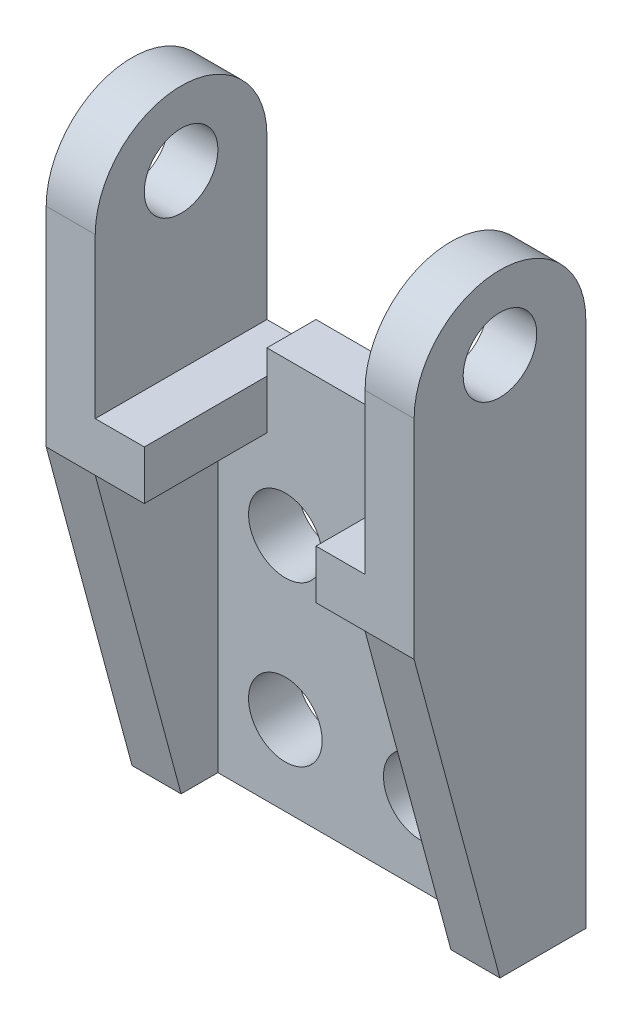
ISO-10303-21;
HEADER;
FILE_DESCRIPTION(('STEP AP214'),'2;1');
FILE_NAME('part.step','',(''),(''),'','','');
FILE_SCHEMA(('AUTOMOTIVE_DESIGN { 1 0 10303 214 1 1 1 1 }'));
ENDSEC;
DATA;
#1=APPLICATION_CONTEXT('core data for automotive mechanical design processes');
#2=APPLICATION_PROTOCOL_DEFINITION('international standard','automotive_design',2000,#1);
#3=PRODUCT_CONTEXT('',#1,'mechanical');
#4=PRODUCT('Part','Part','',(#3));
#5=PRODUCT_RELATED_PRODUCT_CATEGORY('part','',(#4));
#6=PRODUCT_DEFINITION_FORMATION('','',#4);
#7=PRODUCT_DEFINITION_CONTEXT('part definition',#1,'design');
#8=PRODUCT_DEFINITION('design','',#6,#7);
#9=PRODUCT_DEFINITION_SHAPE('','',#8);
#10=(LENGTH_UNIT() NAMED_UNIT(*) SI_UNIT(.MILLI.,.METRE.));
#11=(NAMED_UNIT(*) PLANE_ANGLE_UNIT() SI_UNIT($,.RADIAN.));
#12=(NAMED_UNIT(*) SI_UNIT($,.STERADIAN.) SOLID_ANGLE_UNIT());
#13=UNCERTAINTY_MEASURE_WITH_UNIT(LENGTH_MEASURE(1.E-05),#10,'distance_accuracy_value','');
#14=(GEOMETRIC_REPRESENTATION_CONTEXT(3) GLOBAL_UNCERTAINTY_ASSIGNED_CONTEXT((#13)) GLOBAL_UNIT_ASSIGNED_CONTEXT((#10,
#11,#12)) REPRESENTATION_CONTEXT('',''));
#15=CARTESIAN_POINT('',(0.,0.,0.));
#16=DIRECTION('',(0.,0.,1.));
#17=DIRECTION('',(1.,0.,0.));
#18=AXIS2_PLACEMENT_3D('',#15,#16,#17);
#19=CARTESIAN_POINT('',(7.5,9.,3.5));
#20=DIRECTION('',(-1.,0.,0.));
#21=DIRECTION('',(0.,0.,1.));
#22=AXIS2_PLACEMENT_3D('',#19,#20,#21);
#23=CYLINDRICAL_SURFACE('',#22,3.5);
#24=DIRECTION('',(1.,0.,0.));
#25=VECTOR('',#24,1.);
#26=CARTESIAN_POINT('',(7.5,9.,7.));
#27=LINE('',#26,#25);
#28=CARTESIAN_POINT('',(7.5,9.,7.));
#29=VERTEX_POINT('',#28);
#30=CARTESIAN_POINT('',(5.5,9.,7.));
#31=VERTEX_POINT('',#30);
#32=EDGE_CURVE('E360',#29,#31,#27,.F.);
#33=ORIENTED_EDGE('',*,*,#32,.F.);
#34=CARTESIAN_POINT('',(7.5,9.,3.5));
#35=DIRECTION('',(-1.,0.,0.));
#36=DIRECTION('',(0.,-1.,0.));
#37=AXIS2_PLACEMENT_3D('',#34,#35,#36);
#38=CIRCLE('',#37,3.5);
#39=CARTESIAN_POINT('',(7.5,9.,0.));
#40=VERTEX_POINT('',#39);
#41=EDGE_CURVE('E45',#40,#29,#38,.F.);
#42=ORIENTED_EDGE('',*,*,#41,.F.);
#43=DIRECTION('',(-1.,0.,0.));
#44=VECTOR('',#43,1.);
#45=CARTESIAN_POINT('',(0.,9.,0.));
#46=LINE('',#45,#44);
#47=CARTESIAN_POINT('',(5.5,9.,0.));
#48=VERTEX_POINT('',#47);
#49=EDGE_CURVE('E363',#48,#40,#46,.F.);
#50=ORIENTED_EDGE('',*,*,#49,.F.);
#51=CARTESIAN_POINT('',(5.5,9.,3.5));
#52=DIRECTION('',(1.,0.,0.));
#53=DIRECTION('',(0.,0.,-1.));
#54=AXIS2_PLACEMENT_3D('',#51,#52,#53);
#55=CIRCLE('',#54,3.5);
#56=EDGE_CURVE('E11',#31,#48,#55,.F.);
#57=ORIENTED_EDGE('',*,*,#56,.F.);
#58=EDGE_LOOP('',(#33,#42,#50,#57));
#59=FACE_BOUND('',#58,.T.);
#60=ADVANCED_FACE('F37',(#59),#23,.T.);
#61=CARTESIAN_POINT('',(-5.50000000000001,9.,3.5));
#62=DIRECTION('',(-1.,0.,0.));
#63=DIRECTION('',(0.,0.,1.));
#64=AXIS2_PLACEMENT_3D('',#61,#62,#63);
#65=CYLINDRICAL_SURFACE('',#64,3.5);
#66=DIRECTION('',(1.,0.,0.));
#67=VECTOR('',#66,1.);
#68=CARTESIAN_POINT('',(-5.50000000000001,9.,7.));
#69=LINE('',#68,#67);
#70=CARTESIAN_POINT('',(-5.50000000000001,9.,7.));
#71=VERTEX_POINT('',#70);
#72=CARTESIAN_POINT('',(-7.5,9.,7.));
#73=VERTEX_POINT('',#72);
#74=EDGE_CURVE('E347',#71,#73,#69,.F.);
#75=ORIENTED_EDGE('',*,*,#74,.F.);
#76=CARTESIAN_POINT('',(-5.50000000000001,9.,3.5));
#77=DIRECTION('',(1.,0.,0.));
#78=DIRECTION('',(0.,1.,0.));
#79=AXIS2_PLACEMENT_3D('',#76,#77,#78);
#80=CIRCLE('',#79,3.5);
#81=CARTESIAN_POINT('',(-5.50000000000001,9.,0.));
#82=VERTEX_POINT('',#81);
#83=EDGE_CURVE('E356',#82,#71,#80,.T.);
#84=ORIENTED_EDGE('',*,*,#83,.F.);
#85=DIRECTION('',(-1.,0.,0.));
#86=VECTOR('',#85,1.);
#87=CARTESIAN_POINT('',(0.,9.,0.));
#88=LINE('',#87,#86);
#89=CARTESIAN_POINT('',(-7.5,9.,0.));
#90=VERTEX_POINT('',#89);
#91=EDGE_CURVE('E354',#90,#82,#88,.F.);
#92=ORIENTED_EDGE('',*,*,#91,.F.);
#93=CARTESIAN_POINT('',(-7.5,9.,3.5));
#94=DIRECTION('',(1.,0.,0.));
#95=DIRECTION('',(0.,1.,0.));
#96=AXIS2_PLACEMENT_3D('',#93,#94,#95);
#97=CIRCLE('',#96,3.5);
#98=EDGE_CURVE('E358',#73,#90,#97,.F.);
#99=ORIENTED_EDGE('',*,*,#98,.F.);
#100=EDGE_LOOP('',(#75,#84,#92,#99));
#101=FACE_BOUND('',#100,.T.);
#102=ADVANCED_FACE('F423',(#101),#65,.T.);
#103=CARTESIAN_POINT('',(0.,0.,0.));
#104=DIRECTION('',(0.,0.,1.));
#105=DIRECTION('',(1.,0.,0.));
#106=AXIS2_PLACEMENT_3D('',#103,#104,#105);
#107=PLANE('',#106);
#108=CARTESIAN_POINT('',(-2.75,-2.75,0.));
#109=DIRECTION('',(0.,0.,1.));
#110=DIRECTION('',(1.,0.,0.));
#111=AXIS2_PLACEMENT_3D('',#108,#109,#110);
#112=CIRCLE('',#111,1.5);
#113=CARTESIAN_POINT('',(-1.25,-2.75,0.));
#114=VERTEX_POINT('',#113);
#115=EDGE_CURVE('E252',#114,#114,#112,.T.);
#116=ORIENTED_EDGE('',*,*,#115,.T.);
#117=EDGE_LOOP('',(#116));
#118=FACE_BOUND('',#117,.T.);
#119=CARTESIAN_POINT('',(2.75,-2.75,0.));
#120=DIRECTION('',(0.,0.,1.));
#121=DIRECTION('',(1.,0.,0.));
#122=AXIS2_PLACEMENT_3D('',#119,#120,#121);
#123=CIRCLE('',#122,1.5);
#124=CARTESIAN_POINT('',(4.25,-2.75,0.));
#125=VERTEX_POINT('',#124);
#126=EDGE_CURVE('E246',#125,#125,#123,.T.);
#127=ORIENTED_EDGE('',*,*,#126,.T.);
#128=EDGE_LOOP('',(#127));
#129=FACE_BOUND('',#128,.T.);
#130=CARTESIAN_POINT('',(-2.75,-9.25000000000001,0.));
#131=DIRECTION('',(0.,0.,1.));
#132=DIRECTION('',(1.,0.,0.));
#133=AXIS2_PLACEMENT_3D('',#130,#131,#132);
#134=CIRCLE('',#133,1.5);
#135=CARTESIAN_POINT('',(-1.25,-9.25000000000001,0.));
#136=VERTEX_POINT('',#135);
#137=EDGE_CURVE('E240',#136,#136,#134,.T.);
#138=ORIENTED_EDGE('',*,*,#137,.T.);
#139=EDGE_LOOP('',(#138));
#140=FACE_BOUND('',#139,.T.);
#141=CARTESIAN_POINT('',(2.75,-9.25,0.));
#142=DIRECTION('',(0.,0.,1.));
#143=DIRECTION('',(1.,0.,0.));
#144=AXIS2_PLACEMENT_3D('',#141,#142,#143);
#145=CIRCLE('',#144,1.5);
#146=CARTESIAN_POINT('',(4.25,-9.25,0.));
#147=VERTEX_POINT('',#146);
#148=EDGE_CURVE('E234',#147,#147,#145,.T.);
#149=ORIENTED_EDGE('',*,*,#148,.T.);
#150=EDGE_LOOP('',(#149));
#151=FACE_BOUND('',#150,.T.);
#152=DIRECTION('',(0.,1.,0.));
#153=VECTOR('',#152,1.);
#154=CARTESIAN_POINT('',(5.5,0.,0.));
#155=LINE('',#154,#153);
#156=CARTESIAN_POINT('',(5.5,2.5,0.));
#157=VERTEX_POINT('',#156);
#158=EDGE_CURVE('E218',#157,#48,#155,.T.);
#159=ORIENTED_EDGE('',*,*,#158,.T.);
#160=ORIENTED_EDGE('',*,*,#49,.T.);
#161=DIRECTION('',(0.,1.,0.));
#162=VECTOR('',#161,1.);
#163=CARTESIAN_POINT('',(7.5,12.5,0.));
#164=LINE('',#163,#162);
#165=CARTESIAN_POINT('',(7.5,-12.5,0.));
#166=VERTEX_POINT('',#165);
#167=EDGE_CURVE('E316',#166,#40,#164,.T.);
#168=ORIENTED_EDGE('',*,*,#167,.F.);
#169=DIRECTION('',(1.,0.,0.));
#170=VECTOR('',#169,1.);
#171=CARTESIAN_POINT('',(-7.5,-12.5,0.));
#172=LINE('',#171,#170);
#173=CARTESIAN_POINT('',(-7.5,-12.5,0.));
#174=VERTEX_POINT('',#173);
#175=EDGE_CURVE('E334',#174,#166,#172,.T.);
#176=ORIENTED_EDGE('',*,*,#175,.F.);
#177=DIRECTION('',(0.,-1.,0.));
#178=VECTOR('',#177,1.);
#179=CARTESIAN_POINT('',(-7.5,12.5,0.));
#180=LINE('',#179,#178);
#181=EDGE_CURVE('E339',#90,#174,#180,.T.);
#182=ORIENTED_EDGE('',*,*,#181,.F.);
#183=ORIENTED_EDGE('',*,*,#91,.T.);
#184=DIRECTION('',(0.,1.,0.));
#185=VECTOR('',#184,1.);
#186=CARTESIAN_POINT('',(-5.49999999999999,0.,0.));
#187=LINE('',#186,#185);
#188=CARTESIAN_POINT('',(-5.5,2.49999999999999,0.));
#189=VERTEX_POINT('',#188);
#190=EDGE_CURVE('E183',#189,#82,#187,.T.);
#191=ORIENTED_EDGE('',*,*,#190,.F.);
#192=DIRECTION('',(-1.,0.,0.));
#193=VECTOR('',#192,1.);
#194=CARTESIAN_POINT('',(0.,2.5,0.));
#195=LINE('',#194,#193);
#196=CARTESIAN_POINT('',(-3.5,2.49999999999999,0.));
#197=VERTEX_POINT('',#196);
#198=EDGE_CURVE('E184',#197,#189,#195,.T.);
#199=ORIENTED_EDGE('',*,*,#198,.F.);
#200=DIRECTION('',(0.,-1.,0.));
#201=VECTOR('',#200,1.);
#202=CARTESIAN_POINT('',(-3.49999999999999,0.,0.));
#203=LINE('',#202,#201);
#204=CARTESIAN_POINT('',(-3.5,3.5,0.));
#205=VERTEX_POINT('',#204);
#206=EDGE_CURVE('E172',#205,#197,#203,.T.);
#207=ORIENTED_EDGE('',*,*,#206,.F.);
#208=DIRECTION('',(1.,0.,0.));
#209=VECTOR('',#208,1.);
#210=CARTESIAN_POINT('',(0.,3.5,0.));
#211=LINE('',#210,#209);
#212=CARTESIAN_POINT('',(3.5,3.5,0.));
#213=VERTEX_POINT('',#212);
#214=EDGE_CURVE('E280',#205,#213,#211,.T.);
#215=ORIENTED_EDGE('',*,*,#214,.T.);
#216=DIRECTION('',(0.,-1.,0.));
#217=VECTOR('',#216,1.);
#218=CARTESIAN_POINT('',(3.5,0.,0.));
#219=LINE('',#218,#217);
#220=CARTESIAN_POINT('',(3.5,2.5,0.));
#221=VERTEX_POINT('',#220);
#222=EDGE_CURVE('E221',#213,#221,#219,.T.);
#223=ORIENTED_EDGE('',*,*,#222,.T.);
#224=DIRECTION('',(1.,0.,0.));
#225=VECTOR('',#224,1.);
#226=CARTESIAN_POINT('',(0.,2.5,0.));
#227=LINE('',#226,#225);
#228=EDGE_CURVE('E215',#221,#157,#227,.T.);
#229=ORIENTED_EDGE('',*,*,#228,.T.);
#230=EDGE_LOOP('',(#159,#160,#168,#176,#182,#183,#191,#199,#207,#215,#223,#229));
#231=FACE_BOUND('',#230,.T.);
#232=ADVANCED_FACE('F196',(#118,#129,#140,#151,#231),#107,.F.);
#233=CARTESIAN_POINT('',(0.,0.,7.));
#234=DIRECTION('',(0.,0.,1.));
#235=DIRECTION('',(1.,0.,0.));
#236=AXIS2_PLACEMENT_3D('',#233,#234,#235);
#237=PLANE('',#236);
#238=DIRECTION('',(0.,1.,0.));
#239=VECTOR('',#238,1.);
#240=CARTESIAN_POINT('',(-5.49999999999999,0.,7.));
#241=LINE('',#240,#239);
#242=CARTESIAN_POINT('',(-5.5,2.49999999999999,7.));
#243=VERTEX_POINT('',#242);
#244=EDGE_CURVE('E199',#243,#71,#241,.T.);
#245=ORIENTED_EDGE('',*,*,#244,.T.);
#246=ORIENTED_EDGE('',*,*,#74,.T.);
#247=DIRECTION('',(0.,-1.,0.));
#248=VECTOR('',#247,1.);
#249=CARTESIAN_POINT('',(-7.5,12.5,7.));
#250=LINE('',#249,#248);
#251=CARTESIAN_POINT('',(-7.5,0.499999999999999,7.));
#252=VERTEX_POINT('',#251);
#253=EDGE_CURVE('E333',#73,#252,#250,.T.);
#254=ORIENTED_EDGE('',*,*,#253,.T.);
#255=DIRECTION('',(-1.,0.,0.));
#256=VECTOR('',#255,1.);
#257=CARTESIAN_POINT('',(7.5,0.5,7.));
#258=LINE('',#257,#256);
#259=CARTESIAN_POINT('',(-5.5,0.499999999999999,7.));
#260=VERTEX_POINT('',#259);
#261=EDGE_CURVE('E261',#260,#252,#258,.T.);
#262=ORIENTED_EDGE('',*,*,#261,.F.);
#263=DIRECTION('',(1.,0.,0.));
#264=VECTOR('',#263,1.);
#265=CARTESIAN_POINT('',(0.,0.499999999999999,7.));
#266=LINE('',#265,#264);
#267=CARTESIAN_POINT('',(-3.5,0.499999999999999,7.));
#268=VERTEX_POINT('',#267);
#269=EDGE_CURVE('E287',#260,#268,#266,.T.);
#270=ORIENTED_EDGE('',*,*,#269,.T.);
#271=DIRECTION('',(0.,1.,0.));
#272=VECTOR('',#271,1.);
#273=CARTESIAN_POINT('',(-3.5,0.,7.));
#274=LINE('',#273,#272);
#275=CARTESIAN_POINT('',(-3.5,2.49999999999999,7.));
#276=VERTEX_POINT('',#275);
#277=EDGE_CURVE('E308',#268,#276,#274,.T.);
#278=ORIENTED_EDGE('',*,*,#277,.T.);
#279=DIRECTION('',(-1.,0.,0.));
#280=VECTOR('',#279,1.);
#281=CARTESIAN_POINT('',(0.,2.5,7.));
#282=LINE('',#281,#280);
#283=EDGE_CURVE('E202',#276,#243,#282,.T.);
#284=ORIENTED_EDGE('',*,*,#283,.T.);
#285=EDGE_LOOP('',(#245,#246,#254,#262,#270,#278,#284));
#286=FACE_BOUND('',#285,.T.);
#287=ADVANCED_FACE('F431',(#286),#237,.T.);
#288=CARTESIAN_POINT('',(-3.5,0.,2.));
#289=DIRECTION('',(1.,0.,0.));
#290=DIRECTION('',(0.,1.,0.));
#291=AXIS2_PLACEMENT_3D('',#288,#289,#290);
#292=PLANE('',#291);
#293=DIRECTION('',(0.,1.,0.));
#294=VECTOR('',#293,1.);
#295=CARTESIAN_POINT('',(-3.5,0.,2.));
#296=LINE('',#295,#294);
#297=CARTESIAN_POINT('',(-3.5,0.499999999999999,2.));
#298=VERTEX_POINT('',#297);
#299=CARTESIAN_POINT('',(-3.5,2.49999999999999,2.));
#300=VERTEX_POINT('',#299);
#301=EDGE_CURVE('E290',#298,#300,#296,.T.);
#302=ORIENTED_EDGE('',*,*,#301,.T.);
#303=DIRECTION('',(0.,0.,1.));
#304=VECTOR('',#303,1.);
#305=CARTESIAN_POINT('',(-3.5,2.49999999999999,0.));
#306=LINE('',#305,#304);
#307=EDGE_CURVE('E191',#300,#276,#306,.T.);
#308=ORIENTED_EDGE('',*,*,#307,.T.);
#309=ORIENTED_EDGE('',*,*,#277,.F.);
#310=DIRECTION('',(0.,0.,1.));
#311=VECTOR('',#310,1.);
#312=CARTESIAN_POINT('',(-3.5,0.499999999999999,2.));
#313=LINE('',#312,#311);
#314=EDGE_CURVE('E326',#298,#268,#313,.T.);
#315=ORIENTED_EDGE('',*,*,#314,.F.);
#316=EDGE_LOOP('',(#302,#308,#309,#315));
#317=FACE_BOUND('',#316,.T.);
#318=ADVANCED_FACE('F460',(#317),#292,.T.);
#319=CARTESIAN_POINT('',(0.,0.,2.));
#320=DIRECTION('',(0.,0.,1.));
#321=DIRECTION('',(1.,0.,0.));
#322=AXIS2_PLACEMENT_3D('',#319,#320,#321);
#323=PLANE('',#322);
#324=CARTESIAN_POINT('',(2.75,-9.25,2.));
#325=DIRECTION('',(0.,0.,1.));
#326=DIRECTION('',(1.,0.,0.));
#327=AXIS2_PLACEMENT_3D('',#324,#325,#326);
#328=CIRCLE('',#327,1.5);
#329=CARTESIAN_POINT('',(4.25,-9.25,2.));
#330=VERTEX_POINT('',#329);
#331=EDGE_CURVE('E231',#330,#330,#328,.T.);
#332=ORIENTED_EDGE('',*,*,#331,.F.);
#333=EDGE_LOOP('',(#332));
#334=FACE_BOUND('',#333,.T.);
#335=CARTESIAN_POINT('',(-2.75,-9.25000000000001,2.));
#336=DIRECTION('',(0.,0.,1.));
#337=DIRECTION('',(1.,0.,0.));
#338=AXIS2_PLACEMENT_3D('',#335,#336,#337);
#339=CIRCLE('',#338,1.5);
#340=CARTESIAN_POINT('',(-1.25,-9.25000000000001,2.));
#341=VERTEX_POINT('',#340);
#342=EDGE_CURVE('E237',#341,#341,#339,.T.);
#343=ORIENTED_EDGE('',*,*,#342,.F.);
#344=EDGE_LOOP('',(#343));
#345=FACE_BOUND('',#344,.T.);
#346=CARTESIAN_POINT('',(2.75,-2.75,2.));
#347=DIRECTION('',(0.,0.,1.));
#348=DIRECTION('',(1.,0.,0.));
#349=AXIS2_PLACEMENT_3D('',#346,#347,#348);
#350=CIRCLE('',#349,1.5);
#351=CARTESIAN_POINT('',(4.25,-2.75,2.));
#352=VERTEX_POINT('',#351);
#353=EDGE_CURVE('E243',#352,#352,#350,.T.);
#354=ORIENTED_EDGE('',*,*,#353,.F.);
#355=EDGE_LOOP('',(#354));
#356=FACE_BOUND('',#355,.T.);
#357=CARTESIAN_POINT('',(-2.75,-2.75,2.));
#358=DIRECTION('',(0.,0.,1.));
#359=DIRECTION('',(1.,0.,0.));
#360=AXIS2_PLACEMENT_3D('',#357,#358,#359);
#361=CIRCLE('',#360,1.5);
#362=CARTESIAN_POINT('',(-1.25,-2.75,2.));
#363=VERTEX_POINT('',#362);
#364=EDGE_CURVE('E249',#363,#363,#361,.T.);
#365=ORIENTED_EDGE('',*,*,#364,.F.);
#366=EDGE_LOOP('',(#365));
#367=FACE_BOUND('',#366,.T.);
#368=DIRECTION('',(1.,0.,0.));
#369=VECTOR('',#368,1.);
#370=CARTESIAN_POINT('',(3.5,3.5,2.));
#371=LINE('',#370,#369);
#372=CARTESIAN_POINT('',(-3.5,3.5,2.));
#373=VERTEX_POINT('',#372);
#374=CARTESIAN_POINT('',(3.5,3.5,2.));
#375=VERTEX_POINT('',#374);
#376=EDGE_CURVE('E275',#373,#375,#371,.T.);
#377=ORIENTED_EDGE('',*,*,#376,.F.);
#378=DIRECTION('',(0.,-1.,0.));
#379=VECTOR('',#378,1.);
#380=CARTESIAN_POINT('',(-3.49999999999999,0.,2.));
#381=LINE('',#380,#379);
#382=EDGE_CURVE('E211',#373,#300,#381,.T.);
#383=ORIENTED_EDGE('',*,*,#382,.T.);
#384=ORIENTED_EDGE('',*,*,#301,.F.);
#385=DIRECTION('',(1.,0.,0.));
#386=VECTOR('',#385,1.);
#387=CARTESIAN_POINT('',(0.,0.499999999999999,2.));
#388=LINE('',#387,#386);
#389=CARTESIAN_POINT('',(-5.5,0.499999999999999,2.));
#390=VERTEX_POINT('',#389);
#391=EDGE_CURVE('E293',#390,#298,#388,.T.);
#392=ORIENTED_EDGE('',*,*,#391,.F.);
#393=DIRECTION('',(0.,-1.,0.));
#394=VECTOR('',#393,1.);
#395=CARTESIAN_POINT('',(-5.5,0.,2.));
#396=LINE('',#395,#394);
#397=CARTESIAN_POINT('',(-5.5,-12.5,2.));
#398=VERTEX_POINT('',#397);
#399=EDGE_CURVE('E295',#390,#398,#396,.T.);
#400=ORIENTED_EDGE('',*,*,#399,.T.);
#401=DIRECTION('',(1.,0.,0.));
#402=VECTOR('',#401,1.);
#403=CARTESIAN_POINT('',(0.,-12.5,2.));
#404=LINE('',#403,#402);
#405=CARTESIAN_POINT('',(5.5,-12.5,2.));
#406=VERTEX_POINT('',#405);
#407=EDGE_CURVE('E298',#398,#406,#404,.T.);
#408=ORIENTED_EDGE('',*,*,#407,.T.);
#409=DIRECTION('',(0.,1.,0.));
#410=VECTOR('',#409,1.);
#411=CARTESIAN_POINT('',(5.5,0.,2.));
#412=LINE('',#411,#410);
#413=CARTESIAN_POINT('',(5.5,0.499999999999999,2.));
#414=VERTEX_POINT('',#413);
#415=EDGE_CURVE('E300',#406,#414,#412,.T.);
#416=ORIENTED_EDGE('',*,*,#415,.T.);
#417=DIRECTION('',(1.,0.,0.));
#418=VECTOR('',#417,1.);
#419=CARTESIAN_POINT('',(0.,0.499999999999999,2.));
#420=LINE('',#419,#418);
#421=CARTESIAN_POINT('',(3.5,0.499999999999999,2.));
#422=VERTEX_POINT('',#421);
#423=EDGE_CURVE('E284',#422,#414,#420,.T.);
#424=ORIENTED_EDGE('',*,*,#423,.F.);
#425=DIRECTION('',(0.,-1.,0.));
#426=VECTOR('',#425,1.);
#427=CARTESIAN_POINT('',(3.5,0.,2.));
#428=LINE('',#427,#426);
#429=CARTESIAN_POINT('',(3.5,2.5,2.));
#430=VERTEX_POINT('',#429);
#431=EDGE_CURVE('E286',#430,#422,#428,.T.);
#432=ORIENTED_EDGE('',*,*,#431,.F.);
#433=EDGE_CURVE('E288',#375,#430,#428,.T.);
#434=ORIENTED_EDGE('',*,*,#433,.F.);
#435=EDGE_LOOP('',(#377,#383,#384,#392,#400,#408,#416,#424,#432,#434));
#436=FACE_BOUND('',#435,.T.);
#437=ADVANCED_FACE('F387',(#334,#345,#356,#367,#436),#323,.T.);
#438=CARTESIAN_POINT('',(-7.5,12.5,7.));
#439=DIRECTION('',(1.,0.,0.));
#440=DIRECTION('',(0.,1.,0.));
#441=AXIS2_PLACEMENT_3D('',#438,#439,#440);
#442=PLANE('',#441);
#443=CARTESIAN_POINT('',(-7.5,9.5,3.5));
#444=DIRECTION('',(-1.,0.,0.));
#445=DIRECTION('',(0.,-1.,0.));
#446=AXIS2_PLACEMENT_3D('',#443,#444,#445);
#447=CIRCLE('',#446,1.5);
#448=CARTESIAN_POINT('',(-7.5,8.,3.5));
#449=VERTEX_POINT('',#448);
#450=EDGE_CURVE('E541',#449,#449,#447,.T.);
#451=ORIENTED_EDGE('',*,*,#450,.F.);
#452=EDGE_LOOP('',(#451));
#453=FACE_BOUND('',#452,.T.);
#454=ORIENTED_EDGE('',*,*,#253,.F.);
#455=ORIENTED_EDGE('',*,*,#98,.T.);
#456=ORIENTED_EDGE('',*,*,#181,.T.);
#457=DIRECTION('',(0.,0.,-1.));
#458=VECTOR('',#457,1.);
#459=CARTESIAN_POINT('',(-7.5,-12.5,7.));
#460=LINE('',#459,#458);
#461=CARTESIAN_POINT('',(-7.5,-12.5,3.5));
#462=VERTEX_POINT('',#461);
#463=EDGE_CURVE('E344',#462,#174,#460,.T.);
#464=ORIENTED_EDGE('',*,*,#463,.F.);
#465=DIRECTION('',(0.,-0.965615758520669,-0.259973473447873));
#466=VECTOR('',#465,1.);
#467=CARTESIAN_POINT('',(-7.5,0.499999999999999,7.));
#468=LINE('',#467,#466);
#469=EDGE_CURVE('E255',#252,#462,#468,.T.);
#470=ORIENTED_EDGE('',*,*,#469,.F.);
#471=EDGE_LOOP('',(#454,#455,#456,#464,#470));
#472=FACE_BOUND('',#471,.T.);
#473=ADVANCED_FACE('F441',(#453,#472),#442,.F.);
#474=CARTESIAN_POINT('',(7.5,12.5,7.));
#475=DIRECTION('',(-1.,0.,0.));
#476=DIRECTION('',(0.,-1.,0.));
#477=AXIS2_PLACEMENT_3D('',#474,#475,#476);
#478=PLANE('',#477);
#479=CARTESIAN_POINT('',(7.50000000000001,9.5,3.5));
#480=DIRECTION('',(-1.,0.,0.));
#481=DIRECTION('',(0.,-1.,0.));
#482=AXIS2_PLACEMENT_3D('',#479,#480,#481);
#483=CIRCLE('',#482,1.5);
#484=CARTESIAN_POINT('',(7.50000000000001,8.,3.5));
#485=VERTEX_POINT('',#484);
#486=EDGE_CURVE('E351',#485,#485,#483,.T.);
#487=ORIENTED_EDGE('',*,*,#486,.T.);
#488=EDGE_LOOP('',(#487));
#489=FACE_BOUND('',#488,.T.);
#490=ORIENTED_EDGE('',*,*,#167,.T.);
#491=ORIENTED_EDGE('',*,*,#41,.T.);
#492=DIRECTION('',(0.,1.,0.));
#493=VECTOR('',#492,1.);
#494=CARTESIAN_POINT('',(7.5,12.5,7.));
#495=LINE('',#494,#493);
#496=CARTESIAN_POINT('',(7.5,0.5,7.));
#497=VERTEX_POINT('',#496);
#498=EDGE_CURVE('E330',#497,#29,#495,.T.);
#499=ORIENTED_EDGE('',*,*,#498,.F.);
#500=DIRECTION('',(0.,-0.965615758520669,-0.259973473447873));
#501=VECTOR('',#500,1.);
#502=CARTESIAN_POINT('',(7.5,0.5,7.));
#503=LINE('',#502,#501);
#504=CARTESIAN_POINT('',(7.5,-12.5,3.5));
#505=VERTEX_POINT('',#504);
#506=EDGE_CURVE('E258',#497,#505,#503,.T.);
#507=ORIENTED_EDGE('',*,*,#506,.T.);
#508=DIRECTION('',(0.,0.,-1.));
#509=VECTOR('',#508,1.);
#510=CARTESIAN_POINT('',(7.5,-12.5,7.));
#511=LINE('',#510,#509);
#512=EDGE_CURVE('E336',#505,#166,#511,.T.);
#513=ORIENTED_EDGE('',*,*,#512,.T.);
#514=EDGE_LOOP('',(#490,#491,#499,#507,#513));
#515=FACE_BOUND('',#514,.T.);
#516=ADVANCED_FACE('F366',(#489,#515),#478,.F.);
#517=CARTESIAN_POINT('',(-7.5,-12.5,7.));
#518=DIRECTION('',(0.,1.,0.));
#519=DIRECTION('',(0.,0.,1.));
#520=AXIS2_PLACEMENT_3D('',#517,#518,#519);
#521=PLANE('',#520);
#522=ORIENTED_EDGE('',*,*,#512,.F.);
#523=DIRECTION('',(-1.,0.,0.));
#524=VECTOR('',#523,1.);
#525=CARTESIAN_POINT('',(7.5,-12.5,3.5));
#526=LINE('',#525,#524);
#527=CARTESIAN_POINT('',(5.5,-12.5,3.5));
#528=VERTEX_POINT('',#527);
#529=EDGE_CURVE('E263',#505,#528,#526,.T.);
#530=ORIENTED_EDGE('',*,*,#529,.T.);
#531=DIRECTION('',(0.,0.,1.));
#532=VECTOR('',#531,1.);
#533=CARTESIAN_POINT('',(5.5,-12.5,2.));
#534=LINE('',#533,#532);
#535=EDGE_CURVE('E317',#406,#528,#534,.T.);
#536=ORIENTED_EDGE('',*,*,#535,.F.);
#537=ORIENTED_EDGE('',*,*,#407,.F.);
#538=DIRECTION('',(0.,0.,1.));
#539=VECTOR('',#538,1.);
#540=CARTESIAN_POINT('',(-5.5,-12.5,2.));
#541=LINE('',#540,#539);
#542=CARTESIAN_POINT('',(-5.5,-12.5,3.5));
#543=VERTEX_POINT('',#542);
#544=EDGE_CURVE('E320',#398,#543,#541,.T.);
#545=ORIENTED_EDGE('',*,*,#544,.T.);
#546=EDGE_CURVE('E267',#543,#462,#526,.T.);
#547=ORIENTED_EDGE('',*,*,#546,.T.);
#548=ORIENTED_EDGE('',*,*,#463,.T.);
#549=ORIENTED_EDGE('',*,*,#175,.T.);
#550=EDGE_LOOP('',(#522,#530,#536,#537,#545,#547,#548,#549));
#551=FACE_BOUND('',#550,.T.);
#552=ADVANCED_FACE('F392',(#551),#521,.F.);
#553=ORIENTED_EDGE('',*,*,#498,.T.);
#554=ORIENTED_EDGE('',*,*,#32,.T.);
#555=DIRECTION('',(0.,1.,0.));
#556=VECTOR('',#555,1.);
#557=CARTESIAN_POINT('',(5.5,0.,7.));
#558=LINE('',#557,#556);
#559=CARTESIAN_POINT('',(5.5,2.5,7.));
#560=VERTEX_POINT('',#559);
#561=EDGE_CURVE('E219',#560,#31,#558,.T.);
#562=ORIENTED_EDGE('',*,*,#561,.F.);
#563=DIRECTION('',(1.,0.,0.));
#564=VECTOR('',#563,1.);
#565=CARTESIAN_POINT('',(0.,2.5,7.));
#566=LINE('',#565,#564);
#567=CARTESIAN_POINT('',(3.5,2.5,7.));
#568=VERTEX_POINT('',#567);
#569=EDGE_CURVE('E214',#568,#560,#566,.T.);
#570=ORIENTED_EDGE('',*,*,#569,.F.);
#571=DIRECTION('',(0.,-1.,0.));
#572=VECTOR('',#571,1.);
#573=CARTESIAN_POINT('',(3.5,0.,7.));
#574=LINE('',#573,#572);
#575=CARTESIAN_POINT('',(3.5,0.499999999999999,7.));
#576=VERTEX_POINT('',#575);
#577=EDGE_CURVE('E306',#568,#576,#574,.T.);
#578=ORIENTED_EDGE('',*,*,#577,.T.);
#579=DIRECTION('',(1.,0.,0.));
#580=VECTOR('',#579,1.);
#581=CARTESIAN_POINT('',(0.,0.499999999999999,7.));
#582=LINE('',#581,#580);
#583=CARTESIAN_POINT('',(5.5,0.499999999999999,7.));
#584=VERTEX_POINT('',#583);
#585=EDGE_CURVE('E283',#576,#584,#582,.T.);
#586=ORIENTED_EDGE('',*,*,#585,.T.);
#587=EDGE_CURVE('E268',#497,#584,#258,.T.);
#588=ORIENTED_EDGE('',*,*,#587,.F.);
#589=EDGE_LOOP('',(#553,#554,#562,#570,#578,#586,#588));
#590=FACE_BOUND('',#589,.T.);
#591=ADVANCED_FACE('F371',(#590),#237,.T.);
#592=CARTESIAN_POINT('',(0.,0.499999999999999,2.));
#593=DIRECTION('',(0.,-1.,0.));
#594=DIRECTION('',(0.,0.,-1.));
#595=AXIS2_PLACEMENT_3D('',#592,#593,#594);
#596=PLANE('',#595);
#597=ORIENTED_EDGE('',*,*,#585,.F.);
#598=DIRECTION('',(0.,0.,1.));
#599=VECTOR('',#598,1.);
#600=CARTESIAN_POINT('',(3.5,0.499999999999999,2.));
#601=LINE('',#600,#599);
#602=EDGE_CURVE('E303',#422,#576,#601,.T.);
#603=ORIENTED_EDGE('',*,*,#602,.F.);
#604=ORIENTED_EDGE('',*,*,#423,.T.);
#605=DIRECTION('',(0.,0.,1.));
#606=VECTOR('',#605,1.);
#607=CARTESIAN_POINT('',(5.5,0.499999999999999,2.));
#608=LINE('',#607,#606);
#609=EDGE_CURVE('E313',#414,#584,#608,.T.);
#610=ORIENTED_EDGE('',*,*,#609,.T.);
#611=EDGE_LOOP('',(#597,#603,#604,#610));
#612=FACE_BOUND('',#611,.T.);
#613=ADVANCED_FACE('F381',(#612),#596,.T.);
#614=CARTESIAN_POINT('',(5.5,0.,2.));
#615=DIRECTION('',(1.,0.,0.));
#616=DIRECTION('',(0.,0.,-1.));
#617=AXIS2_PLACEMENT_3D('',#614,#615,#616);
#618=PLANE('',#617);
#619=ORIENTED_EDGE('',*,*,#535,.T.);
#620=DIRECTION('',(0.,0.96561575852067,0.259973473447873));
#621=VECTOR('',#620,1.);
#622=CARTESIAN_POINT('',(5.5,-1.22137931034483,6.53655172413793));
#623=LINE('',#622,#621);
#624=EDGE_CURVE('E272',#528,#584,#623,.T.);
#625=ORIENTED_EDGE('',*,*,#624,.T.);
#626=ORIENTED_EDGE('',*,*,#609,.F.);
#627=ORIENTED_EDGE('',*,*,#415,.F.);
#628=EDGE_LOOP('',(#619,#625,#626,#627));
#629=FACE_BOUND('',#628,.T.);
#630=ADVANCED_FACE('F377',(#629),#618,.F.);
#631=CARTESIAN_POINT('',(-5.5,0.,2.));
#632=DIRECTION('',(-1.,0.,0.));
#633=DIRECTION('',(0.,-1.,0.));
#634=AXIS2_PLACEMENT_3D('',#631,#632,#633);
#635=PLANE('',#634);
#636=DIRECTION('',(0.,0.,1.));
#637=VECTOR('',#636,1.);
#638=CARTESIAN_POINT('',(-5.5,0.499999999999999,2.));
#639=LINE('',#638,#637);
#640=EDGE_CURVE('E323',#390,#260,#639,.T.);
#641=ORIENTED_EDGE('',*,*,#640,.T.);
#642=DIRECTION('',(0.,-0.96561575852067,-0.259973473447873));
#643=VECTOR('',#642,1.);
#644=CARTESIAN_POINT('',(-5.5,-1.22137931034483,6.53655172413793));
#645=LINE('',#644,#643);
#646=EDGE_CURVE('E266',#260,#543,#645,.T.);
#647=ORIENTED_EDGE('',*,*,#646,.T.);
#648=ORIENTED_EDGE('',*,*,#544,.F.);
#649=ORIENTED_EDGE('',*,*,#399,.F.);
#650=EDGE_LOOP('',(#641,#647,#648,#649));
#651=FACE_BOUND('',#650,.T.);
#652=ADVANCED_FACE('F417',(#651),#635,.F.);
#653=CARTESIAN_POINT('',(0.,0.499999999999999,2.));
#654=DIRECTION('',(0.,-1.,0.));
#655=DIRECTION('',(0.,0.,-1.));
#656=AXIS2_PLACEMENT_3D('',#653,#654,#655);
#657=PLANE('',#656);
#658=ORIENTED_EDGE('',*,*,#269,.F.);
#659=ORIENTED_EDGE('',*,*,#640,.F.);
#660=ORIENTED_EDGE('',*,*,#391,.T.);
#661=ORIENTED_EDGE('',*,*,#314,.T.);
#662=EDGE_LOOP('',(#658,#659,#660,#661));
#663=FACE_BOUND('',#662,.T.);
#664=ADVANCED_FACE('F408',(#663),#657,.T.);
#665=CARTESIAN_POINT('',(3.5,0.,2.));
#666=DIRECTION('',(-1.,0.,0.));
#667=DIRECTION('',(0.,-1.,0.));
#668=AXIS2_PLACEMENT_3D('',#665,#666,#667);
#669=PLANE('',#668);
#670=DIRECTION('',(0.,0.,1.));
#671=VECTOR('',#670,1.);
#672=CARTESIAN_POINT('',(3.5,2.5,0.));
#673=LINE('',#672,#671);
#674=EDGE_CURVE('E232',#430,#568,#673,.T.);
#675=ORIENTED_EDGE('',*,*,#674,.F.);
#676=ORIENTED_EDGE('',*,*,#431,.T.);
#677=ORIENTED_EDGE('',*,*,#602,.T.);
#678=ORIENTED_EDGE('',*,*,#577,.F.);
#679=EDGE_LOOP('',(#675,#676,#677,#678));
#680=FACE_BOUND('',#679,.T.);
#681=ADVANCED_FACE('F405',(#680),#669,.T.);
#682=CARTESIAN_POINT('',(3.5,3.5,-11.));
#683=DIRECTION('',(0.,-1.,0.));
#684=DIRECTION('',(1.,0.,0.));
#685=AXIS2_PLACEMENT_3D('',#682,#683,#684);
#686=PLANE('',#685);
#687=DIRECTION('',(0.,0.,1.));
#688=VECTOR('',#687,1.);
#689=CARTESIAN_POINT('',(-3.5,3.5,-11.));
#690=LINE('',#689,#688);
#691=EDGE_CURVE('E178',#205,#373,#690,.T.);
#692=ORIENTED_EDGE('',*,*,#691,.T.);
#693=ORIENTED_EDGE('',*,*,#376,.T.);
#694=DIRECTION('',(0.,0.,1.));
#695=VECTOR('',#694,1.);
#696=CARTESIAN_POINT('',(3.5,3.5,-11.));
#697=LINE('',#696,#695);
#698=EDGE_CURVE('E278',#213,#375,#697,.T.);
#699=ORIENTED_EDGE('',*,*,#698,.F.);
#700=ORIENTED_EDGE('',*,*,#214,.F.);
#701=EDGE_LOOP('',(#692,#693,#699,#700));
#702=FACE_BOUND('',#701,.T.);
#703=ADVANCED_FACE('F407',(#702),#686,.F.);
#704=CARTESIAN_POINT('',(7.5,0.5,7.));
#705=DIRECTION('',(0.,0.259973473447873,-0.96561575852067));
#706=DIRECTION('',(0.,0.96561575852067,0.259973473447873));
#707=AXIS2_PLACEMENT_3D('',#704,#705,#706);
#708=PLANE('',#707);
#709=ORIENTED_EDGE('',*,*,#261,.T.);
#710=ORIENTED_EDGE('',*,*,#469,.T.);
#711=ORIENTED_EDGE('',*,*,#546,.F.);
#712=ORIENTED_EDGE('',*,*,#646,.F.);
#713=EDGE_LOOP('',(#709,#710,#711,#712));
#714=FACE_BOUND('',#713,.T.);
#715=ADVANCED_FACE('F414',(#714),#708,.F.);
#716=ORIENTED_EDGE('',*,*,#529,.F.);
#717=ORIENTED_EDGE('',*,*,#506,.F.);
#718=ORIENTED_EDGE('',*,*,#587,.T.);
#719=ORIENTED_EDGE('',*,*,#624,.F.);
#720=EDGE_LOOP('',(#716,#717,#718,#719));
#721=FACE_BOUND('',#720,.T.);
#722=ADVANCED_FACE('F374',(#721),#708,.F.);
#723=CARTESIAN_POINT('',(-2.75,-2.75,0.));
#724=DIRECTION('',(0.,0.,1.));
#725=DIRECTION('',(1.,0.,0.));
#726=AXIS2_PLACEMENT_3D('',#723,#724,#725);
#727=CYLINDRICAL_SURFACE('',#726,1.5);
#728=ORIENTED_EDGE('',*,*,#115,.F.);
#729=EDGE_LOOP('',(#728));
#730=FACE_BOUND('',#729,.T.);
#731=ORIENTED_EDGE('',*,*,#364,.T.);
#732=EDGE_LOOP('',(#731));
#733=FACE_BOUND('',#732,.T.);
#734=ADVANCED_FACE('F500',(#730,#733),#727,.F.);
#735=CARTESIAN_POINT('',(2.75,-2.75,0.));
#736=DIRECTION('',(0.,0.,1.));
#737=DIRECTION('',(1.,0.,0.));
#738=AXIS2_PLACEMENT_3D('',#735,#736,#737);
#739=CYLINDRICAL_SURFACE('',#738,1.5);
#740=ORIENTED_EDGE('',*,*,#126,.F.);
#741=EDGE_LOOP('',(#740));
#742=FACE_BOUND('',#741,.T.);
#743=ORIENTED_EDGE('',*,*,#353,.T.);
#744=EDGE_LOOP('',(#743));
#745=FACE_BOUND('',#744,.T.);
#746=ADVANCED_FACE('F496',(#742,#745),#739,.F.);
#747=CARTESIAN_POINT('',(-2.75,-9.25000000000001,0.));
#748=DIRECTION('',(0.,0.,1.));
#749=DIRECTION('',(1.,0.,0.));
#750=AXIS2_PLACEMENT_3D('',#747,#748,#749);
#751=CYLINDRICAL_SURFACE('',#750,1.5);
#752=ORIENTED_EDGE('',*,*,#137,.F.);
#753=EDGE_LOOP('',(#752));
#754=FACE_BOUND('',#753,.T.);
#755=ORIENTED_EDGE('',*,*,#342,.T.);
#756=EDGE_LOOP('',(#755));
#757=FACE_BOUND('',#756,.T.);
#758=ADVANCED_FACE('F492',(#754,#757),#751,.F.);
#759=CARTESIAN_POINT('',(2.75,-9.25,0.));
#760=DIRECTION('',(0.,0.,1.));
#761=DIRECTION('',(1.,0.,0.));
#762=AXIS2_PLACEMENT_3D('',#759,#760,#761);
#763=CYLINDRICAL_SURFACE('',#762,1.5);
#764=ORIENTED_EDGE('',*,*,#148,.F.);
#765=EDGE_LOOP('',(#764));
#766=FACE_BOUND('',#765,.T.);
#767=ORIENTED_EDGE('',*,*,#331,.T.);
#768=EDGE_LOOP('',(#767));
#769=FACE_BOUND('',#768,.T.);
#770=ADVANCED_FACE('F485',(#766,#769),#763,.F.);
#771=CARTESIAN_POINT('',(0.,2.5,0.));
#772=DIRECTION('',(0.,-1.,0.));
#773=DIRECTION('',(0.,0.,-1.));
#774=AXIS2_PLACEMENT_3D('',#771,#772,#773);
#775=PLANE('',#774);
#776=ORIENTED_EDGE('',*,*,#569,.T.);
#777=DIRECTION('',(0.,0.,1.));
#778=VECTOR('',#777,1.);
#779=CARTESIAN_POINT('',(5.5,2.5,0.));
#780=LINE('',#779,#778);
#781=EDGE_CURVE('E224',#157,#560,#780,.T.);
#782=ORIENTED_EDGE('',*,*,#781,.F.);
#783=ORIENTED_EDGE('',*,*,#228,.F.);
#784=EDGE_CURVE('E228',#221,#430,#673,.T.);
#785=ORIENTED_EDGE('',*,*,#784,.T.);
#786=ORIENTED_EDGE('',*,*,#674,.T.);
#787=EDGE_LOOP('',(#776,#782,#783,#785,#786));
#788=FACE_BOUND('',#787,.T.);
#789=ADVANCED_FACE('F401',(#788),#775,.F.);
#790=CARTESIAN_POINT('',(3.5,0.,0.));
#791=DIRECTION('',(-1.,0.,0.));
#792=DIRECTION('',(0.,-1.,0.));
#793=AXIS2_PLACEMENT_3D('',#790,#791,#792);
#794=PLANE('',#793);
#795=ORIENTED_EDGE('',*,*,#433,.T.);
#796=ORIENTED_EDGE('',*,*,#784,.F.);
#797=ORIENTED_EDGE('',*,*,#222,.F.);
#798=ORIENTED_EDGE('',*,*,#698,.T.);
#799=EDGE_LOOP('',(#795,#796,#797,#798));
#800=FACE_BOUND('',#799,.T.);
#801=ADVANCED_FACE('F476',(#800),#794,.F.);
#802=CARTESIAN_POINT('',(5.5,0.,0.));
#803=DIRECTION('',(1.,0.,0.));
#804=DIRECTION('',(0.,0.,-1.));
#805=AXIS2_PLACEMENT_3D('',#802,#803,#804);
#806=PLANE('',#805);
#807=CARTESIAN_POINT('',(5.5,9.5,3.5));
#808=DIRECTION('',(1.,0.,0.));
#809=DIRECTION('',(0.,0.,-1.));
#810=AXIS2_PLACEMENT_3D('',#807,#808,#809);
#811=CIRCLE('',#810,1.5);
#812=CARTESIAN_POINT('',(5.5,9.5,2.));
#813=VERTEX_POINT('',#812);
#814=EDGE_CURVE('E205',#813,#813,#811,.T.);
#815=ORIENTED_EDGE('',*,*,#814,.T.);
#816=EDGE_LOOP('',(#815));
#817=FACE_BOUND('',#816,.T.);
#818=ORIENTED_EDGE('',*,*,#561,.T.);
#819=ORIENTED_EDGE('',*,*,#56,.T.);
#820=ORIENTED_EDGE('',*,*,#158,.F.);
#821=ORIENTED_EDGE('',*,*,#781,.T.);
#822=EDGE_LOOP('',(#818,#819,#820,#821));
#823=FACE_BOUND('',#822,.T.);
#824=ADVANCED_FACE('F398',(#817,#823),#806,.F.);
#825=CARTESIAN_POINT('',(0.,2.5,0.));
#826=DIRECTION('',(0.,1.,0.));
#827=DIRECTION('',(-1.,0.,0.));
#828=AXIS2_PLACEMENT_3D('',#825,#826,#827);
#829=PLANE('',#828);
#830=ORIENTED_EDGE('',*,*,#283,.F.);
#831=ORIENTED_EDGE('',*,*,#307,.F.);
#832=EDGE_CURVE('E175',#197,#300,#306,.T.);
#833=ORIENTED_EDGE('',*,*,#832,.F.);
#834=ORIENTED_EDGE('',*,*,#198,.T.);
#835=DIRECTION('',(0.,0.,1.));
#836=VECTOR('',#835,1.);
#837=CARTESIAN_POINT('',(-5.5,2.49999999999999,0.));
#838=LINE('',#837,#836);
#839=EDGE_CURVE('E192',#189,#243,#838,.T.);
#840=ORIENTED_EDGE('',*,*,#839,.T.);
#841=EDGE_LOOP('',(#830,#831,#833,#834,#840));
#842=FACE_BOUND('',#841,.T.);
#843=ADVANCED_FACE('F187',(#842),#829,.T.);
#844=CARTESIAN_POINT('',(-5.49999999999999,0.,0.));
#845=DIRECTION('',(1.,0.,0.));
#846=DIRECTION('',(0.,1.,0.));
#847=AXIS2_PLACEMENT_3D('',#844,#845,#846);
#848=PLANE('',#847);
#849=CARTESIAN_POINT('',(-5.50000000000001,9.5,3.5));
#850=DIRECTION('',(1.,0.,0.));
#851=DIRECTION('',(0.,1.,0.));
#852=AXIS2_PLACEMENT_3D('',#849,#850,#851);
#853=CIRCLE('',#852,1.5);
#854=CARTESIAN_POINT('',(-5.50000000000001,11.,3.5));
#855=VERTEX_POINT('',#854);
#856=EDGE_CURVE('E348',#855,#855,#853,.T.);
#857=ORIENTED_EDGE('',*,*,#856,.F.);
#858=EDGE_LOOP('',(#857));
#859=FACE_BOUND('',#858,.T.);
#860=ORIENTED_EDGE('',*,*,#190,.T.);
#861=ORIENTED_EDGE('',*,*,#83,.T.);
#862=ORIENTED_EDGE('',*,*,#244,.F.);
#863=ORIENTED_EDGE('',*,*,#839,.F.);
#864=EDGE_LOOP('',(#860,#861,#862,#863));
#865=FACE_BOUND('',#864,.T.);
#866=ADVANCED_FACE('F519',(#859,#865),#848,.T.);
#867=CARTESIAN_POINT('',(-3.49999999999999,0.,0.));
#868=DIRECTION('',(-1.,0.,0.));
#869=DIRECTION('',(0.,-1.,0.));
#870=AXIS2_PLACEMENT_3D('',#867,#868,#869);
#871=PLANE('',#870);
#872=ORIENTED_EDGE('',*,*,#691,.F.);
#873=ORIENTED_EDGE('',*,*,#206,.T.);
#874=ORIENTED_EDGE('',*,*,#832,.T.);
#875=ORIENTED_EDGE('',*,*,#382,.F.);
#876=EDGE_LOOP('',(#872,#873,#874,#875));
#877=FACE_BOUND('',#876,.T.);
#878=ADVANCED_FACE('F174',(#877),#871,.T.);
#879=CARTESIAN_POINT('',(7.50000000000001,9.5,3.5));
#880=DIRECTION('',(-1.,0.,0.));
#881=DIRECTION('',(0.,-1.,0.));
#882=AXIS2_PLACEMENT_3D('',#879,#880,#881);
#883=CYLINDRICAL_SURFACE('',#882,1.5);
#884=ORIENTED_EDGE('',*,*,#856,.T.);
#885=EDGE_LOOP('',(#884));
#886=FACE_BOUND('',#885,.T.);
#887=ORIENTED_EDGE('',*,*,#450,.T.);
#888=EDGE_LOOP('',(#887));
#889=FACE_BOUND('',#888,.T.);
#890=ADVANCED_FACE('F528',(#886,#889),#883,.F.);
#891=ORIENTED_EDGE('',*,*,#486,.F.);
#892=EDGE_LOOP('',(#891));
#893=FACE_BOUND('',#892,.T.);
#894=ORIENTED_EDGE('',*,*,#814,.F.);
#895=EDGE_LOOP('',(#894));
#896=FACE_BOUND('',#895,.T.);
#897=ADVANCED_FACE('F532',(#893,#896),#883,.F.);
#898=CLOSED_SHELL('',(#60,#102,#232,#287,#318,#437,#473,#516,#552,#591,#613,#630,#652,#664,#681,
#703,#715,#722,#734,#746,#758,#770,#789,#801,#824,#843,#866,#878,#890,#897));
#899=MANIFOLD_SOLID_BREP('B2',#898);
#900=ADVANCED_BREP_SHAPE_REPRESENTATION('',(#18,#899),#14);
#901=SHAPE_DEFINITION_REPRESENTATION(#9,#900);
ENDSEC;
END-ISO-10303-21;
